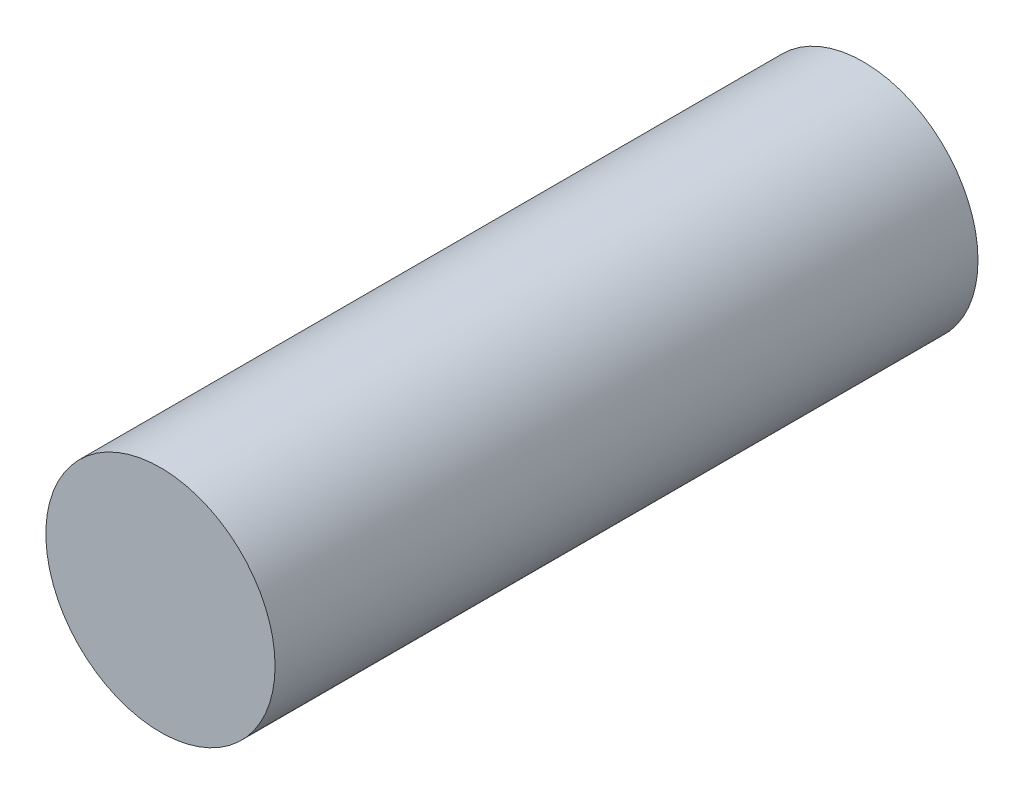
ISO-10303-21;
HEADER;
FILE_DESCRIPTION(('STEP AP214'),'2;1');
FILE_NAME('part.step','',(''),(''),'','','');
FILE_SCHEMA(('AUTOMOTIVE_DESIGN { 1 0 10303 214 1 1 1 1 }'));
ENDSEC;
DATA;
#1=APPLICATION_CONTEXT('core data for automotive mechanical design processes');
#2=APPLICATION_PROTOCOL_DEFINITION('international standard','automotive_design',2000,#1);
#3=PRODUCT_CONTEXT('',#1,'mechanical');
#4=PRODUCT('Part','Part','',(#3));
#5=PRODUCT_RELATED_PRODUCT_CATEGORY('part','',(#4));
#6=PRODUCT_DEFINITION_FORMATION('','',#4);
#7=PRODUCT_DEFINITION_CONTEXT('part definition',#1,'design');
#8=PRODUCT_DEFINITION('design','',#6,#7);
#9=PRODUCT_DEFINITION_SHAPE('','',#8);
#10=(LENGTH_UNIT() NAMED_UNIT(*) SI_UNIT(.MILLI.,.METRE.));
#11=(NAMED_UNIT(*) PLANE_ANGLE_UNIT() SI_UNIT($,.RADIAN.));
#12=(NAMED_UNIT(*) SI_UNIT($,.STERADIAN.) SOLID_ANGLE_UNIT());
#13=UNCERTAINTY_MEASURE_WITH_UNIT(LENGTH_MEASURE(1.E-05),#10,'distance_accuracy_value','');
#14=(GEOMETRIC_REPRESENTATION_CONTEXT(3) GLOBAL_UNCERTAINTY_ASSIGNED_CONTEXT((#13)) GLOBAL_UNIT_ASSIGNED_CONTEXT((#10,
#11,#12)) REPRESENTATION_CONTEXT('',''));
#15=CARTESIAN_POINT('',(0.,0.,0.));
#16=DIRECTION('',(0.,0.,1.));
#17=DIRECTION('',(1.,0.,0.));
#18=AXIS2_PLACEMENT_3D('',#15,#16,#17);
#19=CARTESIAN_POINT('',(0.,0.,36.8));
#20=DIRECTION('',(0.,0.,-1.));
#21=DIRECTION('',(-1.,0.,0.));
#22=AXIS2_PLACEMENT_3D('',#19,#20,#21);
#23=CYLINDRICAL_SURFACE('',#22,6.);
#24=CARTESIAN_POINT('',(0.,0.,36.8));
#25=DIRECTION('',(0.,0.,1.));
#26=DIRECTION('',(1.,0.,0.));
#27=AXIS2_PLACEMENT_3D('',#24,#25,#26);
#28=CIRCLE('',#27,6.);
#29=CARTESIAN_POINT('',(6.,0.,36.8));
#30=VERTEX_POINT('',#29);
#31=EDGE_CURVE('E10',#30,#30,#28,.T.);
#32=ORIENTED_EDGE('',*,*,#31,.F.);
#33=EDGE_LOOP('',(#32));
#34=FACE_BOUND('',#33,.T.);
#35=CARTESIAN_POINT('',(0.,0.,0.));
#36=DIRECTION('',(0.,0.,1.));
#37=DIRECTION('',(1.,0.,0.));
#38=AXIS2_PLACEMENT_3D('',#35,#36,#37);
#39=CIRCLE('',#38,6.);
#40=CARTESIAN_POINT('',(6.,0.,0.));
#41=VERTEX_POINT('',#40);
#42=EDGE_CURVE('E34',#41,#41,#39,.T.);
#43=ORIENTED_EDGE('',*,*,#42,.T.);
#44=EDGE_LOOP('',(#43));
#45=FACE_BOUND('',#44,.T.);
#46=ADVANCED_FACE('F31',(#34,#45),#23,.T.);
#47=CARTESIAN_POINT('',(0.,0.,36.8));
#48=DIRECTION('',(0.,0.,1.));
#49=DIRECTION('',(1.,0.,0.));
#50=AXIS2_PLACEMENT_3D('',#47,#48,#49);
#51=PLANE('',#50);
#52=ORIENTED_EDGE('',*,*,#31,.T.);
#53=EDGE_LOOP('',(#52));
#54=FACE_BOUND('',#53,.T.);
#55=ADVANCED_FACE('F46',(#54),#51,.T.);
#56=CARTESIAN_POINT('',(0.,0.,0.));
#57=DIRECTION('',(0.,0.,1.));
#58=DIRECTION('',(1.,0.,0.));
#59=AXIS2_PLACEMENT_3D('',#56,#57,#58);
#60=PLANE('',#59);
#61=ORIENTED_EDGE('',*,*,#42,.F.);
#62=EDGE_LOOP('',(#61));
#63=FACE_BOUND('',#62,.T.);
#64=ADVANCED_FACE('F44',(#63),#60,.F.);
#65=CLOSED_SHELL('',(#46,#55,#64));
#66=MANIFOLD_SOLID_BREP('B2',#65);
#67=ADVANCED_BREP_SHAPE_REPRESENTATION('',(#18,#66),#14);
#68=SHAPE_DEFINITION_REPRESENTATION(#9,#67);
ENDSEC;
END-ISO-10303-21;
